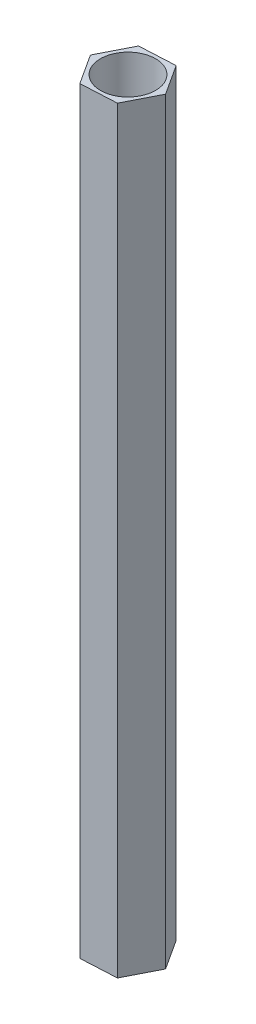
ISO-10303-21;
HEADER;
FILE_DESCRIPTION(('STEP AP214'),'2;1');
FILE_NAME('part.step','',(''),(''),'','','');
FILE_SCHEMA(('AUTOMOTIVE_DESIGN { 1 0 10303 214 1 1 1 1 }'));
ENDSEC;
DATA;
#1=APPLICATION_CONTEXT('core data for automotive mechanical design processes');
#2=APPLICATION_PROTOCOL_DEFINITION('international standard','automotive_design',2000,#1);
#3=PRODUCT_CONTEXT('',#1,'mechanical');
#4=PRODUCT('Part','Part','',(#3));
#5=PRODUCT_RELATED_PRODUCT_CATEGORY('part','',(#4));
#6=PRODUCT_DEFINITION_FORMATION('','',#4);
#7=PRODUCT_DEFINITION_CONTEXT('part definition',#1,'design');
#8=PRODUCT_DEFINITION('design','',#6,#7);
#9=PRODUCT_DEFINITION_SHAPE('','',#8);
#10=(LENGTH_UNIT() NAMED_UNIT(*) SI_UNIT(.MILLI.,.METRE.));
#11=(NAMED_UNIT(*) PLANE_ANGLE_UNIT() SI_UNIT($,.RADIAN.));
#12=(NAMED_UNIT(*) SI_UNIT($,.STERADIAN.) SOLID_ANGLE_UNIT());
#13=UNCERTAINTY_MEASURE_WITH_UNIT(LENGTH_MEASURE(1.E-05),#10,'distance_accuracy_value','');
#14=(GEOMETRIC_REPRESENTATION_CONTEXT(3) GLOBAL_UNCERTAINTY_ASSIGNED_CONTEXT((#13)) GLOBAL_UNIT_ASSIGNED_CONTEXT((#10,
#11,#12)) REPRESENTATION_CONTEXT('',''));
#15=CARTESIAN_POINT('',(0.,0.,0.));
#16=DIRECTION('',(0.,0.,1.));
#17=DIRECTION('',(1.,0.,0.));
#18=AXIS2_PLACEMENT_3D('',#15,#16,#17);
#19=CARTESIAN_POINT('',(0.,55.,0.));
#20=DIRECTION('',(0.,1.,0.));
#21=DIRECTION('',(0.,0.,1.));
#22=AXIS2_PLACEMENT_3D('',#19,#20,#21);
#23=PLANE('',#22);
#24=DIRECTION('',(0.998670900236777,0.,-0.0515405958470099));
#25=VECTOR('',#24,1.);
#26=CARTESIAN_POINT('',(-1.18134521378221,55.,2.31396272352729));
#27=LINE('',#26,#25);
#28=CARTESIAN_POINT('',(-1.18134521378221,55.,2.31396272352729));
#29=VERTEX_POINT('',#28);
#30=CARTESIAN_POINT('',(1.41327789509376,55.,2.1800563275382));
#31=VERTEX_POINT('',#30);
#32=EDGE_CURVE('E129',#29,#31,#27,.T.);
#33=ORIENTED_EDGE('',*,*,#32,.T.);
#34=DIRECTION('',(0.454699984788691,0.,-0.890644667548829));
#35=VECTOR('',#34,1.);
#36=CARTESIAN_POINT('',(1.41327789509376,55.,2.1800563275382));
#37=LINE('',#36,#35);
#38=CARTESIAN_POINT('',(2.59462310887597,55.,-0.133906395989092));
#39=VERTEX_POINT('',#38);
#40=EDGE_CURVE('E87',#31,#39,#37,.T.);
#41=ORIENTED_EDGE('',*,*,#40,.T.);
#42=DIRECTION('',(-0.543970915448086,0.,-0.839104071701819));
#43=VECTOR('',#42,1.);
#44=CARTESIAN_POINT('',(2.59462310887597,55.,-0.133906395989092));
#45=LINE('',#44,#43);
#46=CARTESIAN_POINT('',(1.18134521378221,55.,-2.31396272352729));
#47=VERTEX_POINT('',#46);
#48=EDGE_CURVE('E100',#39,#47,#45,.T.);
#49=ORIENTED_EDGE('',*,*,#48,.T.);
#50=DIRECTION('',(-0.998670900236777,0.,0.0515405958470097));
#51=VECTOR('',#50,1.);
#52=CARTESIAN_POINT('',(1.18134521378221,55.,-2.31396272352729));
#53=LINE('',#52,#51);
#54=CARTESIAN_POINT('',(-1.41327789509376,55.,-2.1800563275382));
#55=VERTEX_POINT('',#54);
#56=EDGE_CURVE('E94',#47,#55,#53,.T.);
#57=ORIENTED_EDGE('',*,*,#56,.T.);
#58=DIRECTION('',(-0.454699984788691,0.,0.890644667548829));
#59=VECTOR('',#58,1.);
#60=CARTESIAN_POINT('',(-1.41327789509376,55.,-2.1800563275382));
#61=LINE('',#60,#59);
#62=CARTESIAN_POINT('',(-2.59462310887597,55.,0.133906395989092));
#63=VERTEX_POINT('',#62);
#64=EDGE_CURVE('E98',#55,#63,#61,.T.);
#65=ORIENTED_EDGE('',*,*,#64,.T.);
#66=DIRECTION('',(0.543970915448086,0.,0.839104071701819));
#67=VECTOR('',#66,1.);
#68=CARTESIAN_POINT('',(-2.59462310887597,55.,0.133906395989092));
#69=LINE('',#68,#67);
#70=EDGE_CURVE('E50',#63,#29,#69,.T.);
#71=ORIENTED_EDGE('',*,*,#70,.T.);
#72=EDGE_LOOP('',(#33,#41,#49,#57,#65,#71));
#73=FACE_BOUND('',#72,.T.);
#74=CARTESIAN_POINT('',(0.,55.,0.));
#75=DIRECTION('',(0.,1.,0.));
#76=DIRECTION('',(0.,0.,1.));
#77=AXIS2_PLACEMENT_3D('',#74,#75,#76);
#78=CIRCLE('',#77,2.);
#79=CARTESIAN_POINT('',(0.,55.,2.));
#80=VERTEX_POINT('',#79);
#81=EDGE_CURVE('E122',#80,#80,#78,.T.);
#82=ORIENTED_EDGE('',*,*,#81,.F.);
#83=EDGE_LOOP('',(#82));
#84=FACE_BOUND('',#83,.T.);
#85=ADVANCED_FACE('F33',(#73,#84),#23,.T.);
#86=CARTESIAN_POINT('',(0.,0.,0.));
#87=DIRECTION('',(0.,1.,0.));
#88=DIRECTION('',(0.,0.,1.));
#89=AXIS2_PLACEMENT_3D('',#86,#87,#88);
#90=PLANE('',#89);
#91=DIRECTION('',(0.998670900236777,0.,-0.0515405958470099));
#92=VECTOR('',#91,1.);
#93=CARTESIAN_POINT('',(-1.18134521378221,0.,2.31396272352729));
#94=LINE('',#93,#92);
#95=CARTESIAN_POINT('',(-1.18134521378221,0.,2.31396272352729));
#96=VERTEX_POINT('',#95);
#97=CARTESIAN_POINT('',(1.41327789509376,0.,2.1800563275382));
#98=VERTEX_POINT('',#97);
#99=EDGE_CURVE('E118',#96,#98,#94,.T.);
#100=ORIENTED_EDGE('',*,*,#99,.F.);
#101=DIRECTION('',(0.543970915448086,0.,0.839104071701819));
#102=VECTOR('',#101,1.);
#103=CARTESIAN_POINT('',(-2.59462310887597,0.,0.133906395989092));
#104=LINE('',#103,#102);
#105=CARTESIAN_POINT('',(-2.59462310887597,0.,0.133906395989092));
#106=VERTEX_POINT('',#105);
#107=EDGE_CURVE('E79',#106,#96,#104,.T.);
#108=ORIENTED_EDGE('',*,*,#107,.F.);
#109=DIRECTION('',(-0.454699984788691,0.,0.890644667548829));
#110=VECTOR('',#109,1.);
#111=CARTESIAN_POINT('',(-1.41327789509376,0.,-2.1800563275382));
#112=LINE('',#111,#110);
#113=CARTESIAN_POINT('',(-1.41327789509376,0.,-2.1800563275382));
#114=VERTEX_POINT('',#113);
#115=EDGE_CURVE('E73',#114,#106,#112,.T.);
#116=ORIENTED_EDGE('',*,*,#115,.F.);
#117=DIRECTION('',(-0.998670900236777,0.,0.0515405958470097));
#118=VECTOR('',#117,1.);
#119=CARTESIAN_POINT('',(1.18134521378221,0.,-2.31396272352729));
#120=LINE('',#119,#118);
#121=CARTESIAN_POINT('',(1.18134521378221,0.,-2.31396272352729));
#122=VERTEX_POINT('',#121);
#123=EDGE_CURVE('E108',#122,#114,#120,.T.);
#124=ORIENTED_EDGE('',*,*,#123,.F.);
#125=DIRECTION('',(-0.543970915448086,0.,-0.839104071701819));
#126=VECTOR('',#125,1.);
#127=CARTESIAN_POINT('',(2.59462310887597,0.,-0.133906395989092));
#128=LINE('',#127,#126);
#129=CARTESIAN_POINT('',(2.59462310887597,0.,-0.133906395989092));
#130=VERTEX_POINT('',#129);
#131=EDGE_CURVE('E124',#130,#122,#128,.T.);
#132=ORIENTED_EDGE('',*,*,#131,.F.);
#133=DIRECTION('',(0.454699984788691,0.,-0.890644667548829));
#134=VECTOR('',#133,1.);
#135=CARTESIAN_POINT('',(1.41327789509376,0.,2.1800563275382));
#136=LINE('',#135,#134);
#137=EDGE_CURVE('E121',#98,#130,#136,.T.);
#138=ORIENTED_EDGE('',*,*,#137,.F.);
#139=EDGE_LOOP('',(#100,#108,#116,#124,#132,#138));
#140=FACE_BOUND('',#139,.T.);
#141=CARTESIAN_POINT('',(0.,0.,0.));
#142=DIRECTION('',(0.,1.,0.));
#143=DIRECTION('',(0.,0.,1.));
#144=AXIS2_PLACEMENT_3D('',#141,#142,#143);
#145=CIRCLE('',#144,2.);
#146=CARTESIAN_POINT('',(0.,0.,2.));
#147=VERTEX_POINT('',#146);
#148=EDGE_CURVE('E222',#147,#147,#145,.T.);
#149=ORIENTED_EDGE('',*,*,#148,.T.);
#150=EDGE_LOOP('',(#149));
#151=FACE_BOUND('',#150,.T.);
#152=ADVANCED_FACE('F138',(#140,#151),#90,.F.);
#153=CARTESIAN_POINT('',(-1.18134521378221,55.,2.31396272352729));
#154=DIRECTION('',(-0.0515405958470099,0.,-0.998670900236777));
#155=DIRECTION('',(-0.998670900236777,0.,0.0515405958470099));
#156=AXIS2_PLACEMENT_3D('',#153,#154,#155);
#157=PLANE('',#156);
#158=ORIENTED_EDGE('',*,*,#99,.T.);
#159=DIRECTION('',(0.,-1.,0.));
#160=VECTOR('',#159,1.);
#161=CARTESIAN_POINT('',(1.41327789509376,55.,2.1800563275382));
#162=LINE('',#161,#160);
#163=EDGE_CURVE('E11',#31,#98,#162,.T.);
#164=ORIENTED_EDGE('',*,*,#163,.F.);
#165=ORIENTED_EDGE('',*,*,#32,.F.);
#166=DIRECTION('',(0.,-1.,0.));
#167=VECTOR('',#166,1.);
#168=CARTESIAN_POINT('',(-1.18134521378221,55.,2.31396272352729));
#169=LINE('',#168,#167);
#170=EDGE_CURVE('E114',#29,#96,#169,.T.);
#171=ORIENTED_EDGE('',*,*,#170,.T.);
#172=EDGE_LOOP('',(#158,#164,#165,#171));
#173=FACE_BOUND('',#172,.T.);
#174=ADVANCED_FACE('F35',(#173),#157,.F.);
#175=CARTESIAN_POINT('',(1.41327789509376,55.,2.1800563275382));
#176=DIRECTION('',(-0.890644667548829,0.,-0.454699984788691));
#177=DIRECTION('',(-0.454699984788691,0.,0.890644667548829));
#178=AXIS2_PLACEMENT_3D('',#175,#176,#177);
#179=PLANE('',#178);
#180=ORIENTED_EDGE('',*,*,#137,.T.);
#181=DIRECTION('',(0.,-1.,0.));
#182=VECTOR('',#181,1.);
#183=CARTESIAN_POINT('',(2.59462310887597,55.,-0.133906395989092));
#184=LINE('',#183,#182);
#185=EDGE_CURVE('E42',#39,#130,#184,.T.);
#186=ORIENTED_EDGE('',*,*,#185,.F.);
#187=ORIENTED_EDGE('',*,*,#40,.F.);
#188=ORIENTED_EDGE('',*,*,#163,.T.);
#189=EDGE_LOOP('',(#180,#186,#187,#188));
#190=FACE_BOUND('',#189,.T.);
#191=ADVANCED_FACE('F163',(#190),#179,.F.);
#192=CARTESIAN_POINT('',(2.59462310887597,55.,-0.133906395989092));
#193=DIRECTION('',(-0.839104071701819,0.,0.543970915448086));
#194=DIRECTION('',(0.543970915448086,0.,0.839104071701819));
#195=AXIS2_PLACEMENT_3D('',#192,#193,#194);
#196=PLANE('',#195);
#197=ORIENTED_EDGE('',*,*,#131,.T.);
#198=DIRECTION('',(0.,-1.,0.));
#199=VECTOR('',#198,1.);
#200=CARTESIAN_POINT('',(1.18134521378221,55.,-2.31396272352729));
#201=LINE('',#200,#199);
#202=EDGE_CURVE('E109',#47,#122,#201,.T.);
#203=ORIENTED_EDGE('',*,*,#202,.F.);
#204=ORIENTED_EDGE('',*,*,#48,.F.);
#205=ORIENTED_EDGE('',*,*,#185,.T.);
#206=EDGE_LOOP('',(#197,#203,#204,#205));
#207=FACE_BOUND('',#206,.T.);
#208=ADVANCED_FACE('F135',(#207),#196,.F.);
#209=CARTESIAN_POINT('',(1.18134521378221,55.,-2.31396272352729));
#210=DIRECTION('',(0.0515405958470097,0.,0.998670900236777));
#211=DIRECTION('',(0.998670900236777,0.,-0.0515405958470097));
#212=AXIS2_PLACEMENT_3D('',#209,#210,#211);
#213=PLANE('',#212);
#214=ORIENTED_EDGE('',*,*,#123,.T.);
#215=DIRECTION('',(0.,-1.,0.));
#216=VECTOR('',#215,1.);
#217=CARTESIAN_POINT('',(-1.41327789509376,55.,-2.1800563275382));
#218=LINE('',#217,#216);
#219=EDGE_CURVE('E105',#55,#114,#218,.T.);
#220=ORIENTED_EDGE('',*,*,#219,.F.);
#221=ORIENTED_EDGE('',*,*,#56,.F.);
#222=ORIENTED_EDGE('',*,*,#202,.T.);
#223=EDGE_LOOP('',(#214,#220,#221,#222));
#224=FACE_BOUND('',#223,.T.);
#225=ADVANCED_FACE('F106',(#224),#213,.F.);
#226=CARTESIAN_POINT('',(-1.41327789509376,55.,-2.1800563275382));
#227=DIRECTION('',(0.890644667548829,0.,0.454699984788691));
#228=DIRECTION('',(0.454699984788691,0.,-0.890644667548829));
#229=AXIS2_PLACEMENT_3D('',#226,#227,#228);
#230=PLANE('',#229);
#231=ORIENTED_EDGE('',*,*,#115,.T.);
#232=DIRECTION('',(0.,-1.,0.));
#233=VECTOR('',#232,1.);
#234=CARTESIAN_POINT('',(-2.59462310887597,55.,0.133906395989092));
#235=LINE('',#234,#233);
#236=EDGE_CURVE('E110',#63,#106,#235,.T.);
#237=ORIENTED_EDGE('',*,*,#236,.F.);
#238=ORIENTED_EDGE('',*,*,#64,.F.);
#239=ORIENTED_EDGE('',*,*,#219,.T.);
#240=EDGE_LOOP('',(#231,#237,#238,#239));
#241=FACE_BOUND('',#240,.T.);
#242=ADVANCED_FACE('F112',(#241),#230,.F.);
#243=CARTESIAN_POINT('',(-2.59462310887597,55.,0.133906395989092));
#244=DIRECTION('',(0.839104071701819,0.,-0.543970915448086));
#245=DIRECTION('',(-0.543970915448086,0.,-0.839104071701819));
#246=AXIS2_PLACEMENT_3D('',#243,#244,#245);
#247=PLANE('',#246);
#248=ORIENTED_EDGE('',*,*,#107,.T.);
#249=ORIENTED_EDGE('',*,*,#170,.F.);
#250=ORIENTED_EDGE('',*,*,#70,.F.);
#251=ORIENTED_EDGE('',*,*,#236,.T.);
#252=EDGE_LOOP('',(#248,#249,#250,#251));
#253=FACE_BOUND('',#252,.T.);
#254=ADVANCED_FACE('F143',(#253),#247,.F.);
#255=CARTESIAN_POINT('',(0.,55.,0.));
#256=DIRECTION('',(0.,-1.,0.));
#257=DIRECTION('',(0.,0.,-1.));
#258=AXIS2_PLACEMENT_3D('',#255,#256,#257);
#259=CYLINDRICAL_SURFACE('',#258,2.);
#260=ORIENTED_EDGE('',*,*,#81,.T.);
#261=EDGE_LOOP('',(#260));
#262=FACE_BOUND('',#261,.T.);
#263=ORIENTED_EDGE('',*,*,#148,.F.);
#264=EDGE_LOOP('',(#263));
#265=FACE_BOUND('',#264,.T.);
#266=ADVANCED_FACE('F145',(#262,#265),#259,.F.);
#267=CLOSED_SHELL('',(#85,#152,#174,#191,#208,#225,#242,#254,#266));
#268=MANIFOLD_SOLID_BREP('B2',#267);
#269=ADVANCED_BREP_SHAPE_REPRESENTATION('',(#18,#268),#14);
#270=SHAPE_DEFINITION_REPRESENTATION(#9,#269);
ENDSEC;
END-ISO-10303-21;
